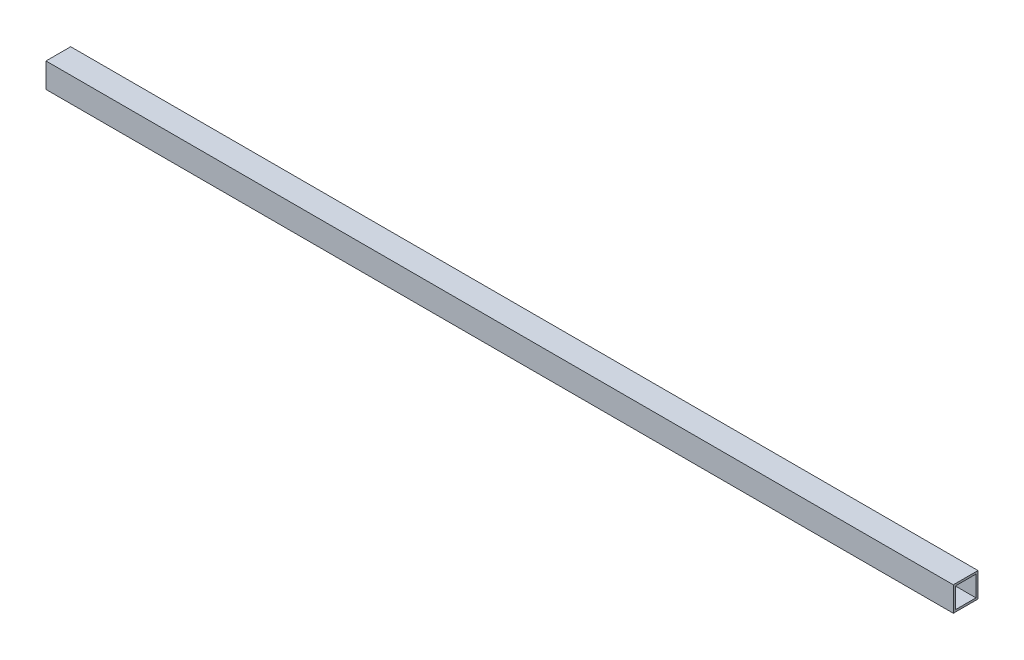
ISO-10303-21;
HEADER;
FILE_DESCRIPTION(('STEP AP214'),'2;1');
FILE_NAME('part.step','',(''),(''),'','','');
FILE_SCHEMA(('AUTOMOTIVE_DESIGN { 1 0 10303 214 1 1 1 1 }'));
ENDSEC;
DATA;
#1=APPLICATION_CONTEXT('core data for automotive mechanical design processes');
#2=APPLICATION_PROTOCOL_DEFINITION('international standard','automotive_design',2000,#1);
#3=PRODUCT_CONTEXT('',#1,'mechanical');
#4=PRODUCT('Part','Part','',(#3));
#5=PRODUCT_RELATED_PRODUCT_CATEGORY('part','',(#4));
#6=PRODUCT_DEFINITION_FORMATION('','',#4);
#7=PRODUCT_DEFINITION_CONTEXT('part definition',#1,'design');
#8=PRODUCT_DEFINITION('design','',#6,#7);
#9=PRODUCT_DEFINITION_SHAPE('','',#8);
#10=(LENGTH_UNIT() NAMED_UNIT(*) SI_UNIT(.MILLI.,.METRE.));
#11=(NAMED_UNIT(*) PLANE_ANGLE_UNIT() SI_UNIT($,.RADIAN.));
#12=(NAMED_UNIT(*) SI_UNIT($,.STERADIAN.) SOLID_ANGLE_UNIT());
#13=UNCERTAINTY_MEASURE_WITH_UNIT(LENGTH_MEASURE(1.E-05),#10,'distance_accuracy_value','');
#14=(GEOMETRIC_REPRESENTATION_CONTEXT(3) GLOBAL_UNCERTAINTY_ASSIGNED_CONTEXT((#13)) GLOBAL_UNIT_ASSIGNED_CONTEXT((#10,
#11,#12)) REPRESENTATION_CONTEXT('',''));
#15=CARTESIAN_POINT('',(0.,0.,0.));
#16=DIRECTION('',(0.,0.,1.));
#17=DIRECTION('',(1.,0.,0.));
#18=AXIS2_PLACEMENT_3D('',#15,#16,#17);
#19=CARTESIAN_POINT('',(-990.321218187243,-13.519098241441,849.747963948175));
#20=DIRECTION('',(0.,-1.,0.));
#21=DIRECTION('',(0.,0.,-1.));
#22=AXIS2_PLACEMENT_3D('',#19,#20,#21);
#23=PLANE('',#22);
#24=DIRECTION('',(0.,0.,1.));
#25=VECTOR('',#24,1.);
#26=CARTESIAN_POINT('',(-963.380449824035,-13.519098241441,849.747963948175));
#27=LINE('',#26,#25);
#28=CARTESIAN_POINT('',(-963.380449824035,-13.519098241441,830.697963948175));
#29=VERTEX_POINT('',#28);
#30=CARTESIAN_POINT('',(-963.380449824035,-13.519098241441,849.747963948175));
#31=VERTEX_POINT('',#30);
#32=EDGE_CURVE('E11',#29,#31,#27,.T.);
#33=ORIENTED_EDGE('',*,*,#32,.F.);
#34=DIRECTION('',(1.,0.,0.));
#35=VECTOR('',#34,1.);
#36=CARTESIAN_POINT('',(-990.321218187243,-13.519098241441,830.697963948175));
#37=LINE('',#36,#35);
#38=CARTESIAN_POINT('',(-263.380449824035,-13.519098241441,830.697963948175));
#39=VERTEX_POINT('',#38);
#40=EDGE_CURVE('E142',#29,#39,#37,.T.);
#41=ORIENTED_EDGE('',*,*,#40,.T.);
#42=DIRECTION('',(0.,0.,-1.));
#43=VECTOR('',#42,1.);
#44=CARTESIAN_POINT('',(-263.380449824035,-13.519098241441,849.747963948175));
#45=LINE('',#44,#43);
#46=CARTESIAN_POINT('',(-263.380449824035,-13.519098241441,849.747963948175));
#47=VERTEX_POINT('',#46);
#48=EDGE_CURVE('E128',#47,#39,#45,.T.);
#49=ORIENTED_EDGE('',*,*,#48,.F.);
#50=DIRECTION('',(1.,0.,0.));
#51=VECTOR('',#50,1.);
#52=CARTESIAN_POINT('',(-990.321218187243,-13.519098241441,849.747963948175));
#53=LINE('',#52,#51);
#54=EDGE_CURVE('E137',#31,#47,#53,.T.);
#55=ORIENTED_EDGE('',*,*,#54,.F.);
#56=EDGE_LOOP('',(#33,#41,#49,#55));
#57=FACE_BOUND('',#56,.T.);
#58=ADVANCED_FACE('F32',(#57),#23,.T.);
#59=CARTESIAN_POINT('',(-990.321218187243,5.53090175855905,830.697963948175));
#60=DIRECTION('',(0.,0.,-1.));
#61=DIRECTION('',(-1.,0.,0.));
#62=AXIS2_PLACEMENT_3D('',#59,#60,#61);
#63=PLANE('',#62);
#64=DIRECTION('',(0.,-1.,0.));
#65=VECTOR('',#64,1.);
#66=CARTESIAN_POINT('',(-963.380449824035,5.53090175855905,830.697963948175));
#67=LINE('',#66,#65);
#68=CARTESIAN_POINT('',(-963.380449824035,5.53090175855905,830.697963948175));
#69=VERTEX_POINT('',#68);
#70=EDGE_CURVE('E162',#69,#29,#67,.T.);
#71=ORIENTED_EDGE('',*,*,#70,.F.);
#72=DIRECTION('',(1.,0.,0.));
#73=VECTOR('',#72,1.);
#74=CARTESIAN_POINT('',(-990.321218187243,5.53090175855905,830.697963948175));
#75=LINE('',#74,#73);
#76=CARTESIAN_POINT('',(-263.380449824035,5.53090175855905,830.697963948175));
#77=VERTEX_POINT('',#76);
#78=EDGE_CURVE('E140',#69,#77,#75,.T.);
#79=ORIENTED_EDGE('',*,*,#78,.T.);
#80=DIRECTION('',(0.,1.,0.));
#81=VECTOR('',#80,1.);
#82=CARTESIAN_POINT('',(-263.380449824035,5.53090175855905,830.697963948175));
#83=LINE('',#82,#81);
#84=EDGE_CURVE('E131',#39,#77,#83,.T.);
#85=ORIENTED_EDGE('',*,*,#84,.F.);
#86=ORIENTED_EDGE('',*,*,#40,.F.);
#87=EDGE_LOOP('',(#71,#79,#85,#86));
#88=FACE_BOUND('',#87,.T.);
#89=ADVANCED_FACE('F187',(#88),#63,.T.);
#90=CARTESIAN_POINT('',(-990.321218187243,5.53090175855905,849.747963948175));
#91=DIRECTION('',(0.,1.,0.));
#92=DIRECTION('',(0.,0.,1.));
#93=AXIS2_PLACEMENT_3D('',#90,#91,#92);
#94=PLANE('',#93);
#95=DIRECTION('',(0.,0.,-1.));
#96=VECTOR('',#95,1.);
#97=CARTESIAN_POINT('',(-963.380449824035,5.53090175855905,849.747963948175));
#98=LINE('',#97,#96);
#99=CARTESIAN_POINT('',(-963.380449824035,5.53090175855905,849.747963948175));
#100=VERTEX_POINT('',#99);
#101=EDGE_CURVE('E159',#100,#69,#98,.T.);
#102=ORIENTED_EDGE('',*,*,#101,.F.);
#103=DIRECTION('',(1.,0.,0.));
#104=VECTOR('',#103,1.);
#105=CARTESIAN_POINT('',(-990.321218187243,5.53090175855905,849.747963948175));
#106=LINE('',#105,#104);
#107=CARTESIAN_POINT('',(-263.380449824035,5.53090175855905,849.747963948175));
#108=VERTEX_POINT('',#107);
#109=EDGE_CURVE('E138',#100,#108,#106,.T.);
#110=ORIENTED_EDGE('',*,*,#109,.T.);
#111=DIRECTION('',(0.,0.,1.));
#112=VECTOR('',#111,1.);
#113=CARTESIAN_POINT('',(-263.380449824035,5.53090175855905,849.747963948175));
#114=LINE('',#113,#112);
#115=EDGE_CURVE('E134',#77,#108,#114,.T.);
#116=ORIENTED_EDGE('',*,*,#115,.F.);
#117=ORIENTED_EDGE('',*,*,#78,.F.);
#118=EDGE_LOOP('',(#102,#110,#116,#117));
#119=FACE_BOUND('',#118,.T.);
#120=ADVANCED_FACE('F158',(#119),#94,.T.);
#121=CARTESIAN_POINT('',(-990.321218187243,5.53090175855905,849.747963948175));
#122=DIRECTION('',(0.,0.,1.));
#123=DIRECTION('',(1.,0.,0.));
#124=AXIS2_PLACEMENT_3D('',#121,#122,#123);
#125=PLANE('',#124);
#126=DIRECTION('',(0.,1.,0.));
#127=VECTOR('',#126,1.);
#128=CARTESIAN_POINT('',(-963.380449824035,5.53090175855905,849.747963948175));
#129=LINE('',#128,#127);
#130=EDGE_CURVE('E149',#31,#100,#129,.T.);
#131=ORIENTED_EDGE('',*,*,#130,.F.);
#132=ORIENTED_EDGE('',*,*,#54,.T.);
#133=DIRECTION('',(0.,-1.,0.));
#134=VECTOR('',#133,1.);
#135=CARTESIAN_POINT('',(-263.380449824035,5.53090175855905,849.747963948175));
#136=LINE('',#135,#134);
#137=EDGE_CURVE('E123',#108,#47,#136,.T.);
#138=ORIENTED_EDGE('',*,*,#137,.F.);
#139=ORIENTED_EDGE('',*,*,#109,.F.);
#140=EDGE_LOOP('',(#131,#132,#138,#139));
#141=FACE_BOUND('',#140,.T.);
#142=ADVANCED_FACE('F34',(#141),#125,.T.);
#143=CARTESIAN_POINT('',(-263.380449824035,0.,0.));
#144=DIRECTION('',(1.,0.,0.));
#145=DIRECTION('',(0.,0.,-1.));
#146=AXIS2_PLACEMENT_3D('',#143,#144,#145);
#147=PLANE('',#146);
#148=DIRECTION('',(0.,-1.,0.));
#149=VECTOR('',#148,1.);
#150=CARTESIAN_POINT('',(-263.380449824035,3.94340175855905,848.160463948175));
#151=LINE('',#150,#149);
#152=CARTESIAN_POINT('',(-263.380449824035,3.94340175855905,848.160463948175));
#153=VERTEX_POINT('',#152);
#154=CARTESIAN_POINT('',(-263.380449824035,-11.931598241441,848.160463948175));
#155=VERTEX_POINT('',#154);
#156=EDGE_CURVE('E111',#153,#155,#151,.T.);
#157=ORIENTED_EDGE('',*,*,#156,.F.);
#158=DIRECTION('',(0.,0.,1.));
#159=VECTOR('',#158,1.);
#160=CARTESIAN_POINT('',(-263.380449824035,3.94340175855905,848.160463948175));
#161=LINE('',#160,#159);
#162=CARTESIAN_POINT('',(-263.380449824035,3.94340175855905,832.285463948175));
#163=VERTEX_POINT('',#162);
#164=EDGE_CURVE('E116',#163,#153,#161,.T.);
#165=ORIENTED_EDGE('',*,*,#164,.F.);
#166=DIRECTION('',(0.,1.,0.));
#167=VECTOR('',#166,1.);
#168=CARTESIAN_POINT('',(-263.380449824035,3.94340175855905,832.285463948175));
#169=LINE('',#168,#167);
#170=CARTESIAN_POINT('',(-263.380449824035,-11.931598241441,832.285463948175));
#171=VERTEX_POINT('',#170);
#172=EDGE_CURVE('E98',#171,#163,#169,.T.);
#173=ORIENTED_EDGE('',*,*,#172,.F.);
#174=DIRECTION('',(0.,0.,-1.));
#175=VECTOR('',#174,1.);
#176=CARTESIAN_POINT('',(-263.380449824035,-11.931598241441,848.160463948175));
#177=LINE('',#176,#175);
#178=EDGE_CURVE('E105',#155,#171,#177,.T.);
#179=ORIENTED_EDGE('',*,*,#178,.F.);
#180=EDGE_LOOP('',(#157,#165,#173,#179));
#181=FACE_BOUND('',#180,.T.);
#182=ORIENTED_EDGE('',*,*,#137,.T.);
#183=ORIENTED_EDGE('',*,*,#48,.T.);
#184=ORIENTED_EDGE('',*,*,#84,.T.);
#185=ORIENTED_EDGE('',*,*,#115,.T.);
#186=EDGE_LOOP('',(#182,#183,#184,#185));
#187=FACE_BOUND('',#186,.T.);
#188=ADVANCED_FACE('F113',(#181,#187),#147,.T.);
#189=CARTESIAN_POINT('',(-990.321218187243,-11.931598241441,848.160463948175));
#190=DIRECTION('',(0.,-1.,0.));
#191=DIRECTION('',(0.,0.,-1.));
#192=AXIS2_PLACEMENT_3D('',#189,#190,#191);
#193=PLANE('',#192);
#194=DIRECTION('',(1.,0.,0.));
#195=VECTOR('',#194,1.);
#196=CARTESIAN_POINT('',(-990.321218187243,-11.931598241441,832.285463948175));
#197=LINE('',#196,#195);
#198=CARTESIAN_POINT('',(-963.380449824035,-11.931598241441,832.285463948175));
#199=VERTEX_POINT('',#198);
#200=EDGE_CURVE('E94',#199,#171,#197,.T.);
#201=ORIENTED_EDGE('',*,*,#200,.F.);
#202=DIRECTION('',(0.,0.,1.));
#203=VECTOR('',#202,1.);
#204=CARTESIAN_POINT('',(-963.380449824035,-11.931598241441,848.160463948175));
#205=LINE('',#204,#203);
#206=CARTESIAN_POINT('',(-963.380449824035,-11.931598241441,848.160463948175));
#207=VERTEX_POINT('',#206);
#208=EDGE_CURVE('E36',#199,#207,#205,.T.);
#209=ORIENTED_EDGE('',*,*,#208,.T.);
#210=DIRECTION('',(1.,0.,0.));
#211=VECTOR('',#210,1.);
#212=CARTESIAN_POINT('',(-990.321218187243,-11.931598241441,848.160463948175));
#213=LINE('',#212,#211);
#214=EDGE_CURVE('E102',#207,#155,#213,.T.);
#215=ORIENTED_EDGE('',*,*,#214,.T.);
#216=ORIENTED_EDGE('',*,*,#178,.T.);
#217=EDGE_LOOP('',(#201,#209,#215,#216));
#218=FACE_BOUND('',#217,.T.);
#219=ADVANCED_FACE('F106',(#218),#193,.F.);
#220=CARTESIAN_POINT('',(-990.321218187243,3.94340175855905,832.285463948175));
#221=DIRECTION('',(0.,0.,-1.));
#222=DIRECTION('',(-1.,0.,0.));
#223=AXIS2_PLACEMENT_3D('',#220,#221,#222);
#224=PLANE('',#223);
#225=DIRECTION('',(1.,0.,0.));
#226=VECTOR('',#225,1.);
#227=CARTESIAN_POINT('',(-990.321218187243,3.94340175855905,832.285463948175));
#228=LINE('',#227,#226);
#229=CARTESIAN_POINT('',(-963.380449824035,3.94340175855905,832.285463948175));
#230=VERTEX_POINT('',#229);
#231=EDGE_CURVE('E101',#230,#163,#228,.T.);
#232=ORIENTED_EDGE('',*,*,#231,.F.);
#233=DIRECTION('',(0.,-1.,0.));
#234=VECTOR('',#233,1.);
#235=CARTESIAN_POINT('',(-963.380449824035,3.94340175855905,832.285463948175));
#236=LINE('',#235,#234);
#237=EDGE_CURVE('E41',#230,#199,#236,.T.);
#238=ORIENTED_EDGE('',*,*,#237,.T.);
#239=ORIENTED_EDGE('',*,*,#200,.T.);
#240=ORIENTED_EDGE('',*,*,#172,.T.);
#241=EDGE_LOOP('',(#232,#238,#239,#240));
#242=FACE_BOUND('',#241,.T.);
#243=ADVANCED_FACE('F96',(#242),#224,.F.);
#244=CARTESIAN_POINT('',(-990.321218187243,3.94340175855905,848.160463948175));
#245=DIRECTION('',(0.,1.,0.));
#246=DIRECTION('',(0.,0.,1.));
#247=AXIS2_PLACEMENT_3D('',#244,#245,#246);
#248=PLANE('',#247);
#249=DIRECTION('',(1.,0.,0.));
#250=VECTOR('',#249,1.);
#251=CARTESIAN_POINT('',(-990.321218187243,3.94340175855905,848.160463948175));
#252=LINE('',#251,#250);
#253=CARTESIAN_POINT('',(-963.380449824035,3.94340175855905,848.160463948175));
#254=VERTEX_POINT('',#253);
#255=EDGE_CURVE('E121',#254,#153,#252,.T.);
#256=ORIENTED_EDGE('',*,*,#255,.F.);
#257=DIRECTION('',(0.,0.,-1.));
#258=VECTOR('',#257,1.);
#259=CARTESIAN_POINT('',(-963.380449824035,3.94340175855905,848.160463948175));
#260=LINE('',#259,#258);
#261=EDGE_CURVE('E174',#254,#230,#260,.T.);
#262=ORIENTED_EDGE('',*,*,#261,.T.);
#263=ORIENTED_EDGE('',*,*,#231,.T.);
#264=ORIENTED_EDGE('',*,*,#164,.T.);
#265=EDGE_LOOP('',(#256,#262,#263,#264));
#266=FACE_BOUND('',#265,.T.);
#267=ADVANCED_FACE('F173',(#266),#248,.F.);
#268=CARTESIAN_POINT('',(-990.321218187243,3.94340175855905,848.160463948175));
#269=DIRECTION('',(0.,0.,1.));
#270=DIRECTION('',(1.,0.,0.));
#271=AXIS2_PLACEMENT_3D('',#268,#269,#270);
#272=PLANE('',#271);
#273=ORIENTED_EDGE('',*,*,#214,.F.);
#274=DIRECTION('',(0.,1.,0.));
#275=VECTOR('',#274,1.);
#276=CARTESIAN_POINT('',(-963.380449824035,3.94340175855905,848.160463948175));
#277=LINE('',#276,#275);
#278=EDGE_CURVE('E164',#207,#254,#277,.T.);
#279=ORIENTED_EDGE('',*,*,#278,.T.);
#280=ORIENTED_EDGE('',*,*,#255,.T.);
#281=ORIENTED_EDGE('',*,*,#156,.T.);
#282=EDGE_LOOP('',(#273,#279,#280,#281));
#283=FACE_BOUND('',#282,.T.);
#284=ADVANCED_FACE('F168',(#283),#272,.F.);
#285=CARTESIAN_POINT('',(-963.380449824035,18.230901758559,849.747963948175));
#286=DIRECTION('',(1.,0.,0.));
#287=DIRECTION('',(0.,0.,-1.));
#288=AXIS2_PLACEMENT_3D('',#285,#286,#287);
#289=PLANE('',#288);
#290=ORIENTED_EDGE('',*,*,#130,.T.);
#291=ORIENTED_EDGE('',*,*,#101,.T.);
#292=ORIENTED_EDGE('',*,*,#70,.T.);
#293=ORIENTED_EDGE('',*,*,#32,.T.);
#294=EDGE_LOOP('',(#290,#291,#292,#293));
#295=FACE_BOUND('',#294,.T.);
#296=ORIENTED_EDGE('',*,*,#208,.F.);
#297=ORIENTED_EDGE('',*,*,#237,.F.);
#298=ORIENTED_EDGE('',*,*,#261,.F.);
#299=ORIENTED_EDGE('',*,*,#278,.F.);
#300=EDGE_LOOP('',(#296,#297,#298,#299));
#301=FACE_BOUND('',#300,.T.);
#302=ADVANCED_FACE('F178',(#295,#301),#289,.F.);
#303=CLOSED_SHELL('',(#58,#89,#120,#142,#188,#219,#243,#267,#284,#302));
#304=MANIFOLD_SOLID_BREP('B2',#303);
#305=ADVANCED_BREP_SHAPE_REPRESENTATION('',(#18,#304),#14);
#306=SHAPE_DEFINITION_REPRESENTATION(#9,#305);
ENDSEC;
END-ISO-10303-21;
